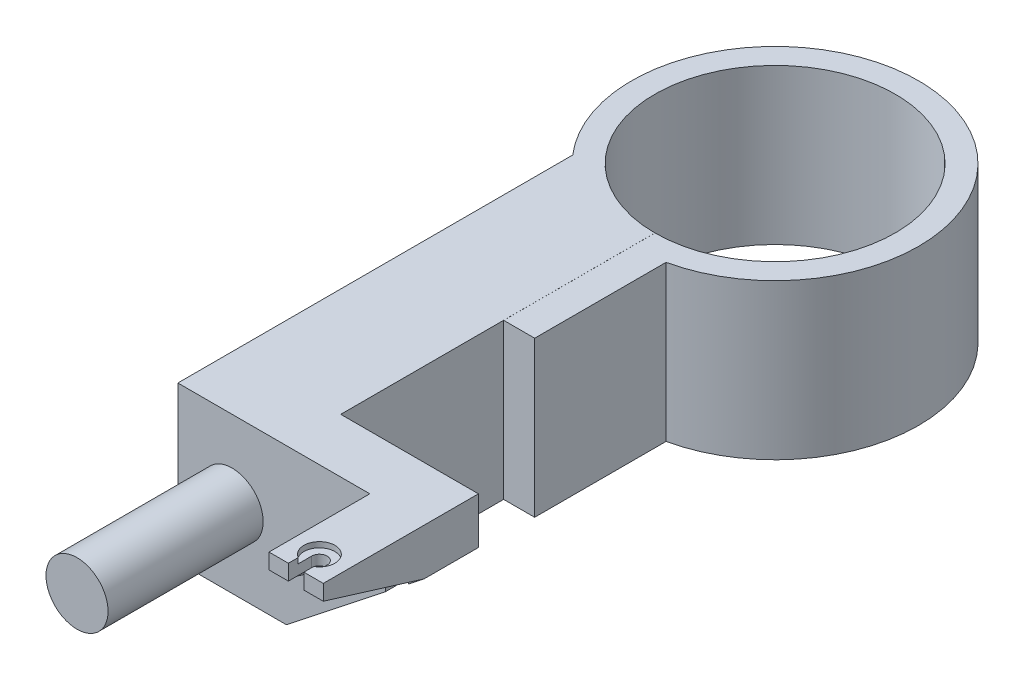
ISO-10303-21;
HEADER;
FILE_DESCRIPTION(('STEP AP214'),'2;1');
FILE_NAME('part.step','',(''),(''),'','','');
FILE_SCHEMA(('AUTOMOTIVE_DESIGN { 1 0 10303 214 1 1 1 1 }'));
ENDSEC;
DATA;
#1=APPLICATION_CONTEXT('core data for automotive mechanical design processes');
#2=APPLICATION_PROTOCOL_DEFINITION('international standard','automotive_design',2000,#1);
#3=PRODUCT_CONTEXT('',#1,'mechanical');
#4=PRODUCT('Part','Part','',(#3));
#5=PRODUCT_RELATED_PRODUCT_CATEGORY('part','',(#4));
#6=PRODUCT_DEFINITION_FORMATION('','',#4);
#7=PRODUCT_DEFINITION_CONTEXT('part definition',#1,'design');
#8=PRODUCT_DEFINITION('design','',#6,#7);
#9=PRODUCT_DEFINITION_SHAPE('','',#8);
#10=(LENGTH_UNIT() NAMED_UNIT(*) SI_UNIT(.MILLI.,.METRE.));
#11=(NAMED_UNIT(*) PLANE_ANGLE_UNIT() SI_UNIT($,.RADIAN.));
#12=(NAMED_UNIT(*) SI_UNIT($,.STERADIAN.) SOLID_ANGLE_UNIT());
#13=UNCERTAINTY_MEASURE_WITH_UNIT(LENGTH_MEASURE(1.E-05),#10,'distance_accuracy_value','');
#14=(GEOMETRIC_REPRESENTATION_CONTEXT(3) GLOBAL_UNCERTAINTY_ASSIGNED_CONTEXT((#13)) GLOBAL_UNIT_ASSIGNED_CONTEXT((#10,
#11,#12)) REPRESENTATION_CONTEXT('',''));
#15=CARTESIAN_POINT('',(0.,0.,0.));
#16=DIRECTION('',(0.,0.,1.));
#17=DIRECTION('',(1.,0.,0.));
#18=AXIS2_PLACEMENT_3D('',#15,#16,#17);
#19=CARTESIAN_POINT('',(14.249394375664,18.,73.));
#20=DIRECTION('',(0.,1.,0.));
#21=DIRECTION('',(0.,0.,1.));
#22=AXIS2_PLACEMENT_3D('',#19,#20,#21);
#23=CYLINDRICAL_SURFACE('',#22,1.);
#24=DIRECTION('',(0.,1.,0.));
#25=VECTOR('',#24,1.);
#26=CARTESIAN_POINT('',(15.249394375664,18.,73.));
#27=LINE('',#26,#25);
#28=CARTESIAN_POINT('',(15.249394375664,18.,73.));
#29=VERTEX_POINT('',#28);
#30=CARTESIAN_POINT('',(15.249394375664,19.3,73.));
#31=VERTEX_POINT('',#30);
#32=EDGE_CURVE('E427',#29,#31,#27,.T.);
#33=ORIENTED_EDGE('',*,*,#32,.T.);
#34=CARTESIAN_POINT('',(14.249394375664,19.3,73.));
#35=DIRECTION('',(0.,1.,0.));
#36=DIRECTION('',(0.,0.,1.));
#37=AXIS2_PLACEMENT_3D('',#34,#35,#36);
#38=CIRCLE('',#37,1.);
#39=CARTESIAN_POINT('',(13.249394375664,19.3,73.));
#40=VERTEX_POINT('',#39);
#41=EDGE_CURVE('E328',#31,#40,#38,.T.);
#42=ORIENTED_EDGE('',*,*,#41,.T.);
#43=DIRECTION('',(0.,1.,0.));
#44=VECTOR('',#43,1.);
#45=CARTESIAN_POINT('',(13.249394375664,18.,73.));
#46=LINE('',#45,#44);
#47=CARTESIAN_POINT('',(13.249394375664,18.,73.));
#48=VERTEX_POINT('',#47);
#49=EDGE_CURVE('E430',#48,#40,#46,.T.);
#50=ORIENTED_EDGE('',*,*,#49,.F.);
#51=CARTESIAN_POINT('',(14.249394375664,18.,73.));
#52=DIRECTION('',(0.,-1.,0.));
#53=DIRECTION('',(0.,0.,1.));
#54=AXIS2_PLACEMENT_3D('',#51,#52,#53);
#55=CIRCLE('',#54,1.);
#56=EDGE_CURVE('E389',#48,#29,#55,.T.);
#57=ORIENTED_EDGE('',*,*,#56,.T.);
#58=EDGE_LOOP('',(#33,#42,#50,#57));
#59=FACE_BOUND('',#58,.T.);
#60=ADVANCED_FACE('F41',(#59),#23,.F.);
#61=CARTESIAN_POINT('',(2.,18.,58.));
#62=DIRECTION('',(-1.,0.,0.));
#63=DIRECTION('',(0.,0.,1.));
#64=AXIS2_PLACEMENT_3D('',#61,#62,#63);
#65=PLANE('',#64);
#66=DIRECTION('',(0.,0.,-1.));
#67=VECTOR('',#66,1.);
#68=CARTESIAN_POINT('',(2.,18.,58.));
#69=LINE('',#68,#67);
#70=CARTESIAN_POINT('',(2.,18.,61.));
#71=VERTEX_POINT('',#70);
#72=CARTESIAN_POINT('',(2.,18.,58.));
#73=VERTEX_POINT('',#72);
#74=EDGE_CURVE('E340',#71,#73,#69,.T.);
#75=ORIENTED_EDGE('',*,*,#74,.F.);
#76=DIRECTION('',(0.,1.,0.));
#77=VECTOR('',#76,1.);
#78=CARTESIAN_POINT('',(2.,18.,61.));
#79=LINE('',#78,#77);
#80=CARTESIAN_POINT('',(2.,1.5775186131641,61.));
#81=VERTEX_POINT('',#80);
#82=EDGE_CURVE('E371',#81,#71,#79,.T.);
#83=ORIENTED_EDGE('',*,*,#82,.F.);
#84=DIRECTION('',(0.,0.,-1.));
#85=VECTOR('',#84,1.);
#86=CARTESIAN_POINT('',(2.,1.5775186131641,58.));
#87=LINE('',#86,#85);
#88=CARTESIAN_POINT('',(2.,1.5775186131641,58.));
#89=VERTEX_POINT('',#88);
#90=EDGE_CURVE('E355',#81,#89,#87,.T.);
#91=ORIENTED_EDGE('',*,*,#90,.T.);
#92=DIRECTION('',(0.,1.,0.));
#93=VECTOR('',#92,1.);
#94=CARTESIAN_POINT('',(2.,18.,58.));
#95=LINE('',#94,#93);
#96=EDGE_CURVE('E372',#89,#73,#95,.T.);
#97=ORIENTED_EDGE('',*,*,#96,.T.);
#98=EDGE_LOOP('',(#75,#83,#91,#97));
#99=FACE_BOUND('',#98,.T.);
#100=ADVANCED_FACE('F532',(#99),#65,.F.);
#101=CARTESIAN_POINT('',(2.,18.,58.));
#102=DIRECTION('',(0.,0.,-1.));
#103=DIRECTION('',(-1.,0.,0.));
#104=AXIS2_PLACEMENT_3D('',#101,#102,#103);
#105=PLANE('',#104);
#106=DIRECTION('',(1.,0.,0.));
#107=VECTOR('',#106,1.);
#108=CARTESIAN_POINT('',(15.749394375664,18.,58.));
#109=LINE('',#108,#107);
#110=CARTESIAN_POINT('',(15.749394375664,18.,58.));
#111=VERTEX_POINT('',#110);
#112=EDGE_CURVE('E337',#73,#111,#109,.T.);
#113=ORIENTED_EDGE('',*,*,#112,.F.);
#114=ORIENTED_EDGE('',*,*,#96,.F.);
#115=DIRECTION('',(0.785155480925612,0.619298692693978,0.));
#116=VECTOR('',#115,1.);
#117=CARTESIAN_POINT('',(9.98536199063244,7.87604719970196,58.));
#118=LINE('',#117,#116);
#119=CARTESIAN_POINT('',(15.749394375664,12.4224813868359,58.));
#120=VERTEX_POINT('',#119);
#121=EDGE_CURVE('E358',#89,#120,#118,.T.);
#122=ORIENTED_EDGE('',*,*,#121,.T.);
#123=DIRECTION('',(0.,1.,0.));
#124=VECTOR('',#123,1.);
#125=CARTESIAN_POINT('',(15.749394375664,18.,58.));
#126=LINE('',#125,#124);
#127=EDGE_CURVE('E376',#120,#111,#126,.T.);
#128=ORIENTED_EDGE('',*,*,#127,.T.);
#129=EDGE_LOOP('',(#113,#114,#122,#128));
#130=FACE_BOUND('',#129,.T.);
#131=ADVANCED_FACE('F535',(#130),#105,.F.);
#132=CARTESIAN_POINT('',(15.749394375664,18.,58.));
#133=DIRECTION('',(1.,0.,0.));
#134=DIRECTION('',(0.,0.,-1.));
#135=AXIS2_PLACEMENT_3D('',#132,#133,#134);
#136=PLANE('',#135);
#137=DIRECTION('',(0.,1.,0.));
#138=VECTOR('',#137,1.);
#139=CARTESIAN_POINT('',(15.749394375664,18.,63.));
#140=LINE('',#139,#138);
#141=CARTESIAN_POINT('',(15.749394375664,12.4224813868359,63.));
#142=VERTEX_POINT('',#141);
#143=CARTESIAN_POINT('',(15.749394375664,14.,63.));
#144=VERTEX_POINT('',#143);
#145=EDGE_CURVE('E322',#142,#144,#140,.T.);
#146=ORIENTED_EDGE('',*,*,#145,.T.);
#147=DIRECTION('',(0.,0.294085848837523,0.95577900872195));
#148=VECTOR('',#147,1.);
#149=CARTESIAN_POINT('',(15.749394375664,12.9405405405405,59.5567567567568));
#150=LINE('',#149,#148);
#151=CARTESIAN_POINT('',(15.749394375664,18.,76.));
#152=VERTEX_POINT('',#151);
#153=EDGE_CURVE('E314',#144,#152,#150,.T.);
#154=ORIENTED_EDGE('',*,*,#153,.T.);
#155=DIRECTION('',(0.,0.,-1.));
#156=VECTOR('',#155,1.);
#157=CARTESIAN_POINT('',(15.749394375664,18.,0.));
#158=LINE('',#157,#156);
#159=EDGE_CURVE('E369',#152,#111,#158,.T.);
#160=ORIENTED_EDGE('',*,*,#159,.T.);
#161=ORIENTED_EDGE('',*,*,#127,.F.);
#162=DIRECTION('',(0.,0.,1.));
#163=VECTOR('',#162,1.);
#164=CARTESIAN_POINT('',(15.749394375664,12.4224813868359,58.));
#165=LINE('',#164,#163);
#166=EDGE_CURVE('E364',#120,#142,#165,.T.);
#167=ORIENTED_EDGE('',*,*,#166,.T.);
#168=EDGE_LOOP('',(#146,#154,#160,#161,#167));
#169=FACE_BOUND('',#168,.T.);
#170=ADVANCED_FACE('F538',(#169),#136,.F.);
#171=CARTESIAN_POINT('',(12.749394375664,18.,61.));
#172=DIRECTION('',(-1.,0.,0.));
#173=DIRECTION('',(0.,0.,1.));
#174=AXIS2_PLACEMENT_3D('',#171,#172,#173);
#175=PLANE('',#174);
#176=DIRECTION('',(0.,0.,-1.));
#177=VECTOR('',#176,1.);
#178=CARTESIAN_POINT('',(12.749394375664,18.,0.));
#179=LINE('',#178,#177);
#180=CARTESIAN_POINT('',(12.749394375664,18.,76.));
#181=VERTEX_POINT('',#180);
#182=CARTESIAN_POINT('',(12.749394375664,18.,61.));
#183=VERTEX_POINT('',#182);
#184=EDGE_CURVE('E367',#181,#183,#179,.T.);
#185=ORIENTED_EDGE('',*,*,#184,.F.);
#186=DIRECTION('',(0.,-0.294085848837523,-0.95577900872195));
#187=VECTOR('',#186,1.);
#188=CARTESIAN_POINT('',(12.749394375664,13.7837837837838,62.2972972972973));
#189=LINE('',#188,#187);
#190=CARTESIAN_POINT('',(12.749394375664,14.,63.));
#191=VERTEX_POINT('',#190);
#192=EDGE_CURVE('E311',#181,#191,#189,.T.);
#193=ORIENTED_EDGE('',*,*,#192,.T.);
#194=DIRECTION('',(0.,-1.,0.));
#195=VECTOR('',#194,1.);
#196=CARTESIAN_POINT('',(12.749394375664,18.,63.));
#197=LINE('',#196,#195);
#198=CARTESIAN_POINT('',(12.749394375664,10.0562034670898,63.));
#199=VERTEX_POINT('',#198);
#200=EDGE_CURVE('E320',#191,#199,#197,.T.);
#201=ORIENTED_EDGE('',*,*,#200,.T.);
#202=DIRECTION('',(0.,0.,-1.));
#203=VECTOR('',#202,1.);
#204=CARTESIAN_POINT('',(12.749394375664,10.0562034670898,61.));
#205=LINE('',#204,#203);
#206=CARTESIAN_POINT('',(12.749394375664,10.0562034670898,61.));
#207=VERTEX_POINT('',#206);
#208=EDGE_CURVE('E352',#199,#207,#205,.T.);
#209=ORIENTED_EDGE('',*,*,#208,.T.);
#210=DIRECTION('',(0.,1.,0.));
#211=VECTOR('',#210,1.);
#212=CARTESIAN_POINT('',(12.749394375664,18.,61.));
#213=LINE('',#212,#211);
#214=EDGE_CURVE('E379',#207,#183,#213,.T.);
#215=ORIENTED_EDGE('',*,*,#214,.T.);
#216=EDGE_LOOP('',(#185,#193,#201,#209,#215));
#217=FACE_BOUND('',#216,.T.);
#218=ADVANCED_FACE('F522',(#217),#175,.F.);
#219=CARTESIAN_POINT('',(2.,18.,61.));
#220=DIRECTION('',(0.,0.,1.));
#221=DIRECTION('',(1.,0.,0.));
#222=AXIS2_PLACEMENT_3D('',#219,#220,#221);
#223=PLANE('',#222);
#224=DIRECTION('',(-1.,0.,0.));
#225=VECTOR('',#224,1.);
#226=CARTESIAN_POINT('',(2.,18.,61.));
#227=LINE('',#226,#225);
#228=EDGE_CURVE('E343',#183,#71,#227,.T.);
#229=ORIENTED_EDGE('',*,*,#228,.F.);
#230=ORIENTED_EDGE('',*,*,#214,.F.);
#231=DIRECTION('',(-0.785155480925612,-0.619298692693978,0.));
#232=VECTOR('',#231,1.);
#233=CARTESIAN_POINT('',(9.98536199063244,7.87604719970196,61.));
#234=LINE('',#233,#232);
#235=EDGE_CURVE('E483',#207,#81,#234,.T.);
#236=ORIENTED_EDGE('',*,*,#235,.T.);
#237=ORIENTED_EDGE('',*,*,#82,.T.);
#238=EDGE_LOOP('',(#229,#230,#236,#237));
#239=FACE_BOUND('',#238,.T.);
#240=ADVANCED_FACE('F528',(#239),#223,.F.);
#241=CARTESIAN_POINT('',(0.,20.,15.5));
#242=DIRECTION('',(-1.,0.,0.));
#243=DIRECTION('',(0.,0.,1.));
#244=AXIS2_PLACEMENT_3D('',#241,#242,#243);
#245=PLANE('',#244);
#246=DIRECTION('',(0.,1.,0.));
#247=VECTOR('',#246,1.);
#248=CARTESIAN_POINT('',(0.,18.,56.));
#249=LINE('',#248,#247);
#250=CARTESIAN_POINT('',(0.,0.,56.));
#251=VERTEX_POINT('',#250);
#252=CARTESIAN_POINT('',(0.,20.,56.));
#253=VERTEX_POINT('',#252);
#254=EDGE_CURVE('E416',#251,#253,#249,.T.);
#255=ORIENTED_EDGE('',*,*,#254,.F.);
#256=DIRECTION('',(0.,0.,-1.));
#257=VECTOR('',#256,1.);
#258=CARTESIAN_POINT('',(0.,0.,15.5));
#259=LINE('',#258,#257);
#260=CARTESIAN_POINT('',(0.,0.,15.5));
#261=VERTEX_POINT('',#260);
#262=EDGE_CURVE('E470',#251,#261,#259,.T.);
#263=ORIENTED_EDGE('',*,*,#262,.T.);
#264=DIRECTION('',(0.,-1.,0.));
#265=VECTOR('',#264,1.);
#266=CARTESIAN_POINT('',(0.,20.,15.5));
#267=LINE('',#266,#265);
#268=CARTESIAN_POINT('',(0.,20.,15.5));
#269=VERTEX_POINT('',#268);
#270=EDGE_CURVE('E252',#269,#261,#267,.T.);
#271=ORIENTED_EDGE('',*,*,#270,.F.);
#272=DIRECTION('',(0.,0.,-1.));
#273=VECTOR('',#272,1.);
#274=CARTESIAN_POINT('',(0.,20.,15.5));
#275=LINE('',#274,#273);
#276=EDGE_CURVE('E248',#253,#269,#275,.T.);
#277=ORIENTED_EDGE('',*,*,#276,.F.);
#278=EDGE_LOOP('',(#255,#263,#271,#277));
#279=FACE_BOUND('',#278,.T.);
#280=ADVANCED_FACE('F560',(#279),#245,.F.);
#281=CARTESIAN_POINT('',(14.249394375664,18.,73.));
#282=DIRECTION('',(0.,1.,0.));
#283=DIRECTION('',(0.,0.,1.));
#284=AXIS2_PLACEMENT_3D('',#281,#282,#283);
#285=PLANE('',#284);
#286=ORIENTED_EDGE('',*,*,#159,.F.);
#287=DIRECTION('',(1.,0.,0.));
#288=VECTOR('',#287,1.);
#289=CARTESIAN_POINT('',(15.249394375664,18.,76.));
#290=LINE('',#289,#288);
#291=CARTESIAN_POINT('',(15.249394375664,18.,76.));
#292=VERTEX_POINT('',#291);
#293=EDGE_CURVE('E395',#292,#152,#290,.T.);
#294=ORIENTED_EDGE('',*,*,#293,.F.);
#295=DIRECTION('',(0.,0.,1.));
#296=VECTOR('',#295,1.);
#297=CARTESIAN_POINT('',(15.249394375664,18.,73.));
#298=LINE('',#297,#296);
#299=EDGE_CURVE('E392',#29,#292,#298,.T.);
#300=ORIENTED_EDGE('',*,*,#299,.F.);
#301=ORIENTED_EDGE('',*,*,#56,.F.);
#302=DIRECTION('',(0.,0.,-1.));
#303=VECTOR('',#302,1.);
#304=CARTESIAN_POINT('',(13.249394375664,18.,73.));
#305=LINE('',#304,#303);
#306=CARTESIAN_POINT('',(13.249394375664,18.,76.));
#307=VERTEX_POINT('',#306);
#308=EDGE_CURVE('E385',#307,#48,#305,.T.);
#309=ORIENTED_EDGE('',*,*,#308,.F.);
#310=DIRECTION('',(1.,0.,0.));
#311=VECTOR('',#310,1.);
#312=CARTESIAN_POINT('',(10.749394375664,18.,76.));
#313=LINE('',#312,#311);
#314=EDGE_CURVE('E383',#181,#307,#313,.T.);
#315=ORIENTED_EDGE('',*,*,#314,.F.);
#316=ORIENTED_EDGE('',*,*,#184,.T.);
#317=ORIENTED_EDGE('',*,*,#228,.T.);
#318=ORIENTED_EDGE('',*,*,#74,.T.);
#319=ORIENTED_EDGE('',*,*,#112,.T.);
#320=EDGE_LOOP('',(#286,#294,#300,#301,#309,#315,#316,#317,#318,#319));
#321=FACE_BOUND('',#320,.T.);
#322=ADVANCED_FACE('F507',(#321),#285,.F.);
#323=CARTESIAN_POINT('',(-14.,20.,63.));
#324=DIRECTION('',(0.,0.,-1.));
#325=DIRECTION('',(-1.,0.,0.));
#326=AXIS2_PLACEMENT_3D('',#323,#324,#325);
#327=PLANE('',#326);
#328=DIRECTION('',(1.,0.,0.));
#329=VECTOR('',#328,1.);
#330=CARTESIAN_POINT('',(-13.1780414969752,14.,63.));
#331=LINE('',#330,#329);
#332=CARTESIAN_POINT('',(10.749394375664,14.,63.));
#333=VERTEX_POINT('',#332);
#334=EDGE_CURVE('E318',#333,#191,#331,.T.);
#335=ORIENTED_EDGE('',*,*,#334,.F.);
#336=DIRECTION('',(0.,1.,0.));
#337=VECTOR('',#336,1.);
#338=CARTESIAN_POINT('',(10.749394375664,18.,63.));
#339=LINE('',#338,#337);
#340=CARTESIAN_POINT('',(10.749394375664,20.,63.));
#341=VERTEX_POINT('',#340);
#342=EDGE_CURVE('E398',#333,#341,#339,.T.);
#343=ORIENTED_EDGE('',*,*,#342,.T.);
#344=DIRECTION('',(1.,0.,0.));
#345=VECTOR('',#344,1.);
#346=CARTESIAN_POINT('',(-14.,20.,63.));
#347=LINE('',#346,#345);
#348=CARTESIAN_POINT('',(-14.,20.,63.));
#349=VERTEX_POINT('',#348);
#350=EDGE_CURVE('E459',#349,#341,#347,.T.);
#351=ORIENTED_EDGE('',*,*,#350,.F.);
#352=DIRECTION('',(0.,-1.,0.));
#353=VECTOR('',#352,1.);
#354=CARTESIAN_POINT('',(-14.,20.,63.));
#355=LINE('',#354,#353);
#356=CARTESIAN_POINT('',(-14.,0.,63.));
#357=VERTEX_POINT('',#356);
#358=EDGE_CURVE('E474',#349,#357,#355,.T.);
#359=ORIENTED_EDGE('',*,*,#358,.T.);
#360=DIRECTION('',(1.,0.,0.));
#361=VECTOR('',#360,1.);
#362=CARTESIAN_POINT('',(-14.,0.,63.));
#363=LINE('',#362,#361);
#364=CARTESIAN_POINT('',(0.,0.,63.));
#365=VERTEX_POINT('',#364);
#366=EDGE_CURVE('E467',#357,#365,#363,.T.);
#367=ORIENTED_EDGE('',*,*,#366,.T.);
#368=DIRECTION('',(0.785155480925612,0.619298692693978,0.));
#369=VECTOR('',#368,1.);
#370=CARTESIAN_POINT('',(1.09434744878945,0.863176734867015,63.));
#371=LINE('',#370,#369);
#372=EDGE_CURVE('E361',#365,#199,#371,.T.);
#373=ORIENTED_EDGE('',*,*,#372,.T.);
#374=ORIENTED_EDGE('',*,*,#200,.F.);
#375=EDGE_LOOP('',(#335,#343,#351,#359,#367,#373,#374));
#376=FACE_BOUND('',#375,.T.);
#377=CARTESIAN_POINT('',(-6.99999999999999,10.,63.));
#378=DIRECTION('',(0.,0.,-1.));
#379=DIRECTION('',(-1.,0.,0.));
#380=AXIS2_PLACEMENT_3D('',#377,#378,#379);
#381=CIRCLE('',#380,4.);
#382=CARTESIAN_POINT('',(-11.,10.,63.));
#383=VERTEX_POINT('',#382);
#384=EDGE_CURVE('E480',#383,#383,#381,.F.);
#385=ORIENTED_EDGE('',*,*,#384,.F.);
#386=EDGE_LOOP('',(#385));
#387=FACE_BOUND('',#386,.T.);
#388=ADVANCED_FACE('F582',(#376,#387),#327,.F.);
#389=CARTESIAN_POINT('',(0.,20.,0.));
#390=DIRECTION('',(0.,1.,0.));
#391=DIRECTION('',(0.,0.,1.));
#392=AXIS2_PLACEMENT_3D('',#389,#390,#391);
#393=PLANE('',#392);
#394=CARTESIAN_POINT('',(14.249394375664,20.,73.));
#395=DIRECTION('',(0.,1.,0.));
#396=DIRECTION('',(0.,0.,1.));
#397=AXIS2_PLACEMENT_3D('',#394,#395,#396);
#398=CIRCLE('',#397,2.);
#399=CARTESIAN_POINT('',(15.249394375664,20.,74.7320508075689));
#400=VERTEX_POINT('',#399);
#401=CARTESIAN_POINT('',(13.249394375664,20.,74.7320508075689));
#402=VERTEX_POINT('',#401);
#403=EDGE_CURVE('E325',#400,#402,#398,.T.);
#404=ORIENTED_EDGE('',*,*,#403,.F.);
#405=DIRECTION('',(0.,0.,1.));
#406=VECTOR('',#405,1.);
#407=CARTESIAN_POINT('',(15.249394375664,20.,73.));
#408=LINE('',#407,#406);
#409=CARTESIAN_POINT('',(15.249394375664,20.,76.));
#410=VERTEX_POINT('',#409);
#411=EDGE_CURVE('E407',#400,#410,#408,.T.);
#412=ORIENTED_EDGE('',*,*,#411,.T.);
#413=DIRECTION('',(1.,0.,0.));
#414=VECTOR('',#413,1.);
#415=CARTESIAN_POINT('',(15.249394375664,20.,76.));
#416=LINE('',#415,#414);
#417=CARTESIAN_POINT('',(17.749394375664,20.,76.));
#418=VERTEX_POINT('',#417);
#419=EDGE_CURVE('E409',#410,#418,#416,.T.);
#420=ORIENTED_EDGE('',*,*,#419,.T.);
#421=DIRECTION('',(0.,0.,-1.));
#422=VECTOR('',#421,1.);
#423=CARTESIAN_POINT('',(17.749394375664,20.,76.));
#424=LINE('',#423,#422);
#425=CARTESIAN_POINT('',(17.749394375664,20.,56.));
#426=VERTEX_POINT('',#425);
#427=EDGE_CURVE('E412',#418,#426,#424,.T.);
#428=ORIENTED_EDGE('',*,*,#427,.T.);
#429=DIRECTION('',(-1.,0.,0.));
#430=VECTOR('',#429,1.);
#431=CARTESIAN_POINT('',(17.749394375664,20.,56.));
#432=LINE('',#431,#430);
#433=EDGE_CURVE('E386',#426,#253,#432,.T.);
#434=ORIENTED_EDGE('',*,*,#433,.T.);
#435=ORIENTED_EDGE('',*,*,#276,.T.);
#436=CARTESIAN_POINT('',(0.,20.,0.));
#437=DIRECTION('',(0.,-1.,0.));
#438=DIRECTION('',(0.,0.,1.));
#439=AXIS2_PLACEMENT_3D('',#436,#437,#438);
#440=CIRCLE('',#439,15.5);
#441=CARTESIAN_POINT('',(0.01,20.,15.4999967741932));
#442=VERTEX_POINT('',#441);
#443=EDGE_CURVE('E239',#269,#442,#440,.T.);
#444=ORIENTED_EDGE('',*,*,#443,.T.);
#445=DIRECTION('',(0.,0.,-1.));
#446=VECTOR('',#445,1.);
#447=CARTESIAN_POINT('',(0.0100000000000048,20.,35.));
#448=LINE('',#447,#446);
#449=CARTESIAN_POINT('',(0.0100000000000048,20.,35.));
#450=VERTEX_POINT('',#449);
#451=EDGE_CURVE('E245',#450,#442,#448,.T.);
#452=ORIENTED_EDGE('',*,*,#451,.F.);
#453=DIRECTION('',(1.,0.,0.));
#454=VECTOR('',#453,1.);
#455=CARTESIAN_POINT('',(0.0100000000000048,20.,35.));
#456=LINE('',#455,#454);
#457=CARTESIAN_POINT('',(4.00000000000001,20.,35.));
#458=VERTEX_POINT('',#457);
#459=EDGE_CURVE('E271',#450,#458,#456,.T.);
#460=ORIENTED_EDGE('',*,*,#459,.T.);
#461=DIRECTION('',(0.,0.,-1.));
#462=VECTOR('',#461,1.);
#463=CARTESIAN_POINT('',(4.00000000000001,20.,35.));
#464=LINE('',#463,#462);
#465=CARTESIAN_POINT('',(4.,20.,18.0623918681884));
#466=VERTEX_POINT('',#465);
#467=EDGE_CURVE('E268',#458,#466,#464,.T.);
#468=ORIENTED_EDGE('',*,*,#467,.T.);
#469=CARTESIAN_POINT('',(0.,20.,0.));
#470=DIRECTION('',(0.,1.,0.));
#471=DIRECTION('',(0.,0.,1.));
#472=AXIS2_PLACEMENT_3D('',#469,#470,#471);
#473=CIRCLE('',#472,18.5);
#474=CARTESIAN_POINT('',(-14.,20.,12.0933866224478));
#475=VERTEX_POINT('',#474);
#476=EDGE_CURVE('E454',#466,#475,#473,.T.);
#477=ORIENTED_EDGE('',*,*,#476,.T.);
#478=DIRECTION('',(0.,0.,1.));
#479=VECTOR('',#478,1.);
#480=CARTESIAN_POINT('',(-14.,20.,12.0933866224478));
#481=LINE('',#480,#479);
#482=EDGE_CURVE('E457',#475,#349,#481,.T.);
#483=ORIENTED_EDGE('',*,*,#482,.T.);
#484=ORIENTED_EDGE('',*,*,#350,.T.);
#485=DIRECTION('',(0.,0.,1.));
#486=VECTOR('',#485,1.);
#487=CARTESIAN_POINT('',(10.749394375664,20.,63.));
#488=LINE('',#487,#486);
#489=CARTESIAN_POINT('',(10.749394375664,20.,76.));
#490=VERTEX_POINT('',#489);
#491=EDGE_CURVE('E375',#341,#490,#488,.T.);
#492=ORIENTED_EDGE('',*,*,#491,.T.);
#493=DIRECTION('',(1.,0.,0.));
#494=VECTOR('',#493,1.);
#495=CARTESIAN_POINT('',(10.749394375664,20.,76.));
#496=LINE('',#495,#494);
#497=CARTESIAN_POINT('',(13.249394375664,20.,76.));
#498=VERTEX_POINT('',#497);
#499=EDGE_CURVE('E401',#490,#498,#496,.T.);
#500=ORIENTED_EDGE('',*,*,#499,.T.);
#501=DIRECTION('',(0.,0.,-1.));
#502=VECTOR('',#501,1.);
#503=CARTESIAN_POINT('',(13.249394375664,20.,73.));
#504=LINE('',#503,#502);
#505=EDGE_CURVE('E404',#498,#402,#504,.T.);
#506=ORIENTED_EDGE('',*,*,#505,.T.);
#507=EDGE_LOOP('',(#404,#412,#420,#428,#434,#435,#444,#452,#460,#468,#477,#483,#484,#492,#500,#506));
#508=FACE_BOUND('',#507,.T.);
#509=ADVANCED_FACE('F242',(#508),#393,.T.);
#510=CARTESIAN_POINT('',(0.,0.,0.));
#511=DIRECTION('',(0.,1.,0.));
#512=DIRECTION('',(0.,0.,1.));
#513=AXIS2_PLACEMENT_3D('',#510,#511,#512);
#514=PLANE('',#513);
#515=ORIENTED_EDGE('',*,*,#262,.F.);
#516=DIRECTION('',(0.,0.,-1.));
#517=VECTOR('',#516,1.);
#518=CARTESIAN_POINT('',(0.,0.,78.));
#519=LINE('',#518,#517);
#520=EDGE_CURVE('E349',#365,#251,#519,.T.);
#521=ORIENTED_EDGE('',*,*,#520,.F.);
#522=ORIENTED_EDGE('',*,*,#366,.F.);
#523=DIRECTION('',(0.,0.,1.));
#524=VECTOR('',#523,1.);
#525=CARTESIAN_POINT('',(-14.,0.,12.0933866224478));
#526=LINE('',#525,#524);
#527=CARTESIAN_POINT('',(-14.,0.,12.0933866224478));
#528=VERTEX_POINT('',#527);
#529=EDGE_CURVE('E465',#528,#357,#526,.T.);
#530=ORIENTED_EDGE('',*,*,#529,.F.);
#531=CARTESIAN_POINT('',(0.,0.,0.));
#532=DIRECTION('',(0.,1.,0.));
#533=DIRECTION('',(0.,0.,1.));
#534=AXIS2_PLACEMENT_3D('',#531,#532,#533);
#535=CIRCLE('',#534,18.5);
#536=CARTESIAN_POINT('',(4.,0.,18.0623918681884));
#537=VERTEX_POINT('',#536);
#538=EDGE_CURVE('E453',#537,#528,#535,.T.);
#539=ORIENTED_EDGE('',*,*,#538,.F.);
#540=DIRECTION('',(0.,0.,1.));
#541=VECTOR('',#540,1.);
#542=CARTESIAN_POINT('',(4.00000000000001,0.,35.));
#543=LINE('',#542,#541);
#544=CARTESIAN_POINT('',(4.00000000000001,0.,35.));
#545=VERTEX_POINT('',#544);
#546=EDGE_CURVE('E262',#537,#545,#543,.T.);
#547=ORIENTED_EDGE('',*,*,#546,.T.);
#548=DIRECTION('',(-1.,0.,0.));
#549=VECTOR('',#548,1.);
#550=CARTESIAN_POINT('',(0.0100000000000048,0.,35.));
#551=LINE('',#550,#549);
#552=CARTESIAN_POINT('',(0.0100000000000048,0.,35.));
#553=VERTEX_POINT('',#552);
#554=EDGE_CURVE('E283',#545,#553,#551,.T.);
#555=ORIENTED_EDGE('',*,*,#554,.T.);
#556=DIRECTION('',(0.,0.,1.));
#557=VECTOR('',#556,1.);
#558=CARTESIAN_POINT('',(0.0100000000000048,0.,35.));
#559=LINE('',#558,#557);
#560=CARTESIAN_POINT('',(0.01,0.,15.4999967741932));
#561=VERTEX_POINT('',#560);
#562=EDGE_CURVE('E274',#561,#553,#559,.T.);
#563=ORIENTED_EDGE('',*,*,#562,.F.);
#564=CARTESIAN_POINT('',(0.,0.,0.));
#565=DIRECTION('',(0.,-1.,0.));
#566=DIRECTION('',(0.,0.,1.));
#567=AXIS2_PLACEMENT_3D('',#564,#565,#566);
#568=CIRCLE('',#567,15.5);
#569=EDGE_CURVE('E258',#261,#561,#568,.T.);
#570=ORIENTED_EDGE('',*,*,#569,.F.);
#571=EDGE_LOOP('',(#515,#521,#522,#530,#539,#547,#555,#563,#570));
#572=FACE_BOUND('',#571,.T.);
#573=ADVANCED_FACE('F562',(#572),#514,.F.);
#574=CARTESIAN_POINT('',(0.,20.,0.));
#575=DIRECTION('',(0.,-1.,0.));
#576=DIRECTION('',(0.,0.,-1.));
#577=AXIS2_PLACEMENT_3D('',#574,#575,#576);
#578=CYLINDRICAL_SURFACE('',#577,18.5);
#579=ORIENTED_EDGE('',*,*,#538,.T.);
#580=DIRECTION('',(0.,-1.,0.));
#581=VECTOR('',#580,1.);
#582=CARTESIAN_POINT('',(-14.,20.,12.0933866224478));
#583=LINE('',#582,#581);
#584=EDGE_CURVE('E477',#475,#528,#583,.T.);
#585=ORIENTED_EDGE('',*,*,#584,.F.);
#586=ORIENTED_EDGE('',*,*,#476,.F.);
#587=DIRECTION('',(0.,1.,0.));
#588=VECTOR('',#587,1.);
#589=CARTESIAN_POINT('',(4.,-56.6083032778761,18.0623918681884));
#590=LINE('',#589,#588);
#591=EDGE_CURVE('E263',#537,#466,#590,.T.);
#592=ORIENTED_EDGE('',*,*,#591,.F.);
#593=EDGE_LOOP('',(#579,#585,#586,#592));
#594=FACE_BOUND('',#593,.T.);
#595=ADVANCED_FACE('F43',(#594),#578,.T.);
#596=CARTESIAN_POINT('',(-14.,20.,12.0933866224478));
#597=DIRECTION('',(1.,0.,0.));
#598=DIRECTION('',(0.,0.,-1.));
#599=AXIS2_PLACEMENT_3D('',#596,#597,#598);
#600=PLANE('',#599);
#601=ORIENTED_EDGE('',*,*,#529,.T.);
#602=ORIENTED_EDGE('',*,*,#358,.F.);
#603=ORIENTED_EDGE('',*,*,#482,.F.);
#604=ORIENTED_EDGE('',*,*,#584,.T.);
#605=EDGE_LOOP('',(#601,#602,#603,#604));
#606=FACE_BOUND('',#605,.T.);
#607=ADVANCED_FACE('F577',(#606),#600,.F.);
#608=CARTESIAN_POINT('',(0.,20.,0.));
#609=DIRECTION('',(0.,-1.,0.));
#610=DIRECTION('',(0.,0.,-1.));
#611=AXIS2_PLACEMENT_3D('',#608,#609,#610);
#612=CYLINDRICAL_SURFACE('',#611,15.5);
#613=ORIENTED_EDGE('',*,*,#569,.T.);
#614=DIRECTION('',(0.,1.,0.));
#615=VECTOR('',#614,1.);
#616=CARTESIAN_POINT('',(0.01,-56.6083032778761,15.4999967741932));
#617=LINE('',#616,#615);
#618=EDGE_CURVE('E255',#561,#442,#617,.T.);
#619=ORIENTED_EDGE('',*,*,#618,.T.);
#620=ORIENTED_EDGE('',*,*,#443,.F.);
#621=ORIENTED_EDGE('',*,*,#270,.T.);
#622=EDGE_LOOP('',(#613,#619,#620,#621));
#623=FACE_BOUND('',#622,.T.);
#624=ADVANCED_FACE('F256',(#623),#612,.F.);
#625=CARTESIAN_POINT('',(-6.99999999999999,10.,83.));
#626=DIRECTION('',(0.,0.,-1.));
#627=DIRECTION('',(-1.,0.,0.));
#628=AXIS2_PLACEMENT_3D('',#625,#626,#627);
#629=CYLINDRICAL_SURFACE('',#628,4.);
#630=CARTESIAN_POINT('',(-6.99999999999999,10.,83.));
#631=DIRECTION('',(0.,0.,1.));
#632=DIRECTION('',(1.,0.,0.));
#633=AXIS2_PLACEMENT_3D('',#630,#631,#632);
#634=CIRCLE('',#633,4.);
#635=CARTESIAN_POINT('',(-2.99999999999999,10.,83.));
#636=VERTEX_POINT('',#635);
#637=EDGE_CURVE('E419',#636,#636,#634,.T.);
#638=ORIENTED_EDGE('',*,*,#637,.F.);
#639=EDGE_LOOP('',(#638));
#640=FACE_BOUND('',#639,.T.);
#641=ORIENTED_EDGE('',*,*,#384,.T.);
#642=EDGE_LOOP('',(#641));
#643=FACE_BOUND('',#642,.T.);
#644=ADVANCED_FACE('F729',(#640,#643),#629,.T.);
#645=CARTESIAN_POINT('',(-6.99999999999999,10.,83.));
#646=DIRECTION('',(0.,0.,1.));
#647=DIRECTION('',(1.,0.,0.));
#648=AXIS2_PLACEMENT_3D('',#645,#646,#647);
#649=PLANE('',#648);
#650=ORIENTED_EDGE('',*,*,#637,.T.);
#651=EDGE_LOOP('',(#650));
#652=FACE_BOUND('',#651,.T.);
#653=ADVANCED_FACE('F613',(#652),#649,.T.);
#654=CARTESIAN_POINT('',(17.749394375664,18.,56.));
#655=DIRECTION('',(0.,0.,-1.));
#656=DIRECTION('',(-1.,0.,0.));
#657=AXIS2_PLACEMENT_3D('',#654,#655,#656);
#658=PLANE('',#657);
#659=DIRECTION('',(0.785155480925612,0.619298692693978,0.));
#660=VECTOR('',#659,1.);
#661=CARTESIAN_POINT('',(0.,0.,56.));
#662=LINE('',#661,#660);
#663=CARTESIAN_POINT('',(17.749394375664,14.,56.));
#664=VERTEX_POINT('',#663);
#665=EDGE_CURVE('E346',#251,#664,#662,.T.);
#666=ORIENTED_EDGE('',*,*,#665,.F.);
#667=ORIENTED_EDGE('',*,*,#254,.T.);
#668=ORIENTED_EDGE('',*,*,#433,.F.);
#669=DIRECTION('',(0.,1.,0.));
#670=VECTOR('',#669,1.);
#671=CARTESIAN_POINT('',(17.749394375664,18.,56.));
#672=LINE('',#671,#670);
#673=EDGE_CURVE('E420',#664,#426,#672,.T.);
#674=ORIENTED_EDGE('',*,*,#673,.F.);
#675=EDGE_LOOP('',(#666,#667,#668,#674));
#676=FACE_BOUND('',#675,.T.);
#677=ADVANCED_FACE('F556',(#676),#658,.T.);
#678=CARTESIAN_POINT('',(17.749394375664,18.,76.));
#679=DIRECTION('',(1.,0.,0.));
#680=DIRECTION('',(0.,0.,-1.));
#681=AXIS2_PLACEMENT_3D('',#678,#679,#680);
#682=PLANE('',#681);
#683=DIRECTION('',(0.,0.294085848837523,0.95577900872195));
#684=VECTOR('',#683,1.);
#685=CARTESIAN_POINT('',(17.749394375664,14.,63.));
#686=LINE('',#685,#684);
#687=CARTESIAN_POINT('',(17.749394375664,14.,63.));
#688=VERTEX_POINT('',#687);
#689=CARTESIAN_POINT('',(17.749394375664,18.,76.));
#690=VERTEX_POINT('',#689);
#691=EDGE_CURVE('E302',#688,#690,#686,.T.);
#692=ORIENTED_EDGE('',*,*,#691,.F.);
#693=DIRECTION('',(0.,0.,-1.));
#694=VECTOR('',#693,1.);
#695=CARTESIAN_POINT('',(17.749394375664,14.,78.));
#696=LINE('',#695,#694);
#697=EDGE_CURVE('E350',#688,#664,#696,.T.);
#698=ORIENTED_EDGE('',*,*,#697,.T.);
#699=ORIENTED_EDGE('',*,*,#673,.T.);
#700=ORIENTED_EDGE('',*,*,#427,.F.);
#701=DIRECTION('',(0.,1.,0.));
#702=VECTOR('',#701,1.);
#703=CARTESIAN_POINT('',(17.749394375664,18.,76.));
#704=LINE('',#703,#702);
#705=EDGE_CURVE('E422',#690,#418,#704,.T.);
#706=ORIENTED_EDGE('',*,*,#705,.F.);
#707=EDGE_LOOP('',(#692,#698,#699,#700,#706));
#708=FACE_BOUND('',#707,.T.);
#709=ADVANCED_FACE('F552',(#708),#682,.T.);
#710=CARTESIAN_POINT('',(15.249394375664,18.,76.));
#711=DIRECTION('',(0.,0.,1.));
#712=DIRECTION('',(1.,0.,0.));
#713=AXIS2_PLACEMENT_3D('',#710,#711,#712);
#714=PLANE('',#713);
#715=DIRECTION('',(1.,0.,0.));
#716=VECTOR('',#715,1.);
#717=CARTESIAN_POINT('',(-3.47890914337223,18.,76.));
#718=LINE('',#717,#716);
#719=EDGE_CURVE('E307',#152,#690,#718,.T.);
#720=ORIENTED_EDGE('',*,*,#719,.T.);
#721=ORIENTED_EDGE('',*,*,#705,.T.);
#722=ORIENTED_EDGE('',*,*,#419,.F.);
#723=DIRECTION('',(0.,1.,0.));
#724=VECTOR('',#723,1.);
#725=CARTESIAN_POINT('',(15.249394375664,18.,76.));
#726=LINE('',#725,#724);
#727=EDGE_CURVE('E424',#292,#410,#726,.T.);
#728=ORIENTED_EDGE('',*,*,#727,.F.);
#729=ORIENTED_EDGE('',*,*,#293,.T.);
#730=EDGE_LOOP('',(#720,#721,#722,#728,#729));
#731=FACE_BOUND('',#730,.T.);
#732=ADVANCED_FACE('F511',(#731),#714,.T.);
#733=CARTESIAN_POINT('',(15.249394375664,18.,73.));
#734=DIRECTION('',(-1.,0.,0.));
#735=DIRECTION('',(0.,0.,1.));
#736=AXIS2_PLACEMENT_3D('',#733,#734,#735);
#737=PLANE('',#736);
#738=DIRECTION('',(0.,1.,0.));
#739=VECTOR('',#738,1.);
#740=CARTESIAN_POINT('',(15.249394375664,19.3,74.7320508075689));
#741=LINE('',#740,#739);
#742=CARTESIAN_POINT('',(15.249394375664,19.3,74.7320508075689));
#743=VERTEX_POINT('',#742);
#744=EDGE_CURVE('E335',#743,#400,#741,.T.);
#745=ORIENTED_EDGE('',*,*,#744,.F.);
#746=DIRECTION('',(0.,0.,-1.));
#747=VECTOR('',#746,1.);
#748=CARTESIAN_POINT('',(15.249394375664,19.3,73.));
#749=LINE('',#748,#747);
#750=EDGE_CURVE('E332',#743,#31,#749,.T.);
#751=ORIENTED_EDGE('',*,*,#750,.T.);
#752=ORIENTED_EDGE('',*,*,#32,.F.);
#753=ORIENTED_EDGE('',*,*,#299,.T.);
#754=ORIENTED_EDGE('',*,*,#727,.T.);
#755=ORIENTED_EDGE('',*,*,#411,.F.);
#756=EDGE_LOOP('',(#745,#751,#752,#753,#754,#755));
#757=FACE_BOUND('',#756,.T.);
#758=ADVANCED_FACE('F503',(#757),#737,.T.);
#759=CARTESIAN_POINT('',(13.249394375664,18.,73.));
#760=DIRECTION('',(1.,0.,0.));
#761=DIRECTION('',(0.,0.,-1.));
#762=AXIS2_PLACEMENT_3D('',#759,#760,#761);
#763=PLANE('',#762);
#764=DIRECTION('',(0.,1.,0.));
#765=VECTOR('',#764,1.);
#766=CARTESIAN_POINT('',(13.249394375664,19.3,74.7320508075689));
#767=LINE('',#766,#765);
#768=CARTESIAN_POINT('',(13.249394375664,19.3,74.7320508075689));
#769=VERTEX_POINT('',#768);
#770=EDGE_CURVE('E50',#402,#769,#767,.F.);
#771=ORIENTED_EDGE('',*,*,#770,.F.);
#772=ORIENTED_EDGE('',*,*,#505,.F.);
#773=DIRECTION('',(0.,1.,0.));
#774=VECTOR('',#773,1.);
#775=CARTESIAN_POINT('',(13.249394375664,18.,76.));
#776=LINE('',#775,#774);
#777=EDGE_CURVE('E433',#307,#498,#776,.T.);
#778=ORIENTED_EDGE('',*,*,#777,.F.);
#779=ORIENTED_EDGE('',*,*,#308,.T.);
#780=ORIENTED_EDGE('',*,*,#49,.T.);
#781=DIRECTION('',(0.,0.,1.));
#782=VECTOR('',#781,1.);
#783=CARTESIAN_POINT('',(13.249394375664,19.3,73.));
#784=LINE('',#783,#782);
#785=EDGE_CURVE('E486',#40,#769,#784,.T.);
#786=ORIENTED_EDGE('',*,*,#785,.T.);
#787=EDGE_LOOP('',(#771,#772,#778,#779,#780,#786));
#788=FACE_BOUND('',#787,.T.);
#789=ADVANCED_FACE('F496',(#788),#763,.T.);
#790=CARTESIAN_POINT('',(10.749394375664,18.,76.));
#791=DIRECTION('',(0.,0.,1.));
#792=DIRECTION('',(1.,0.,0.));
#793=AXIS2_PLACEMENT_3D('',#790,#791,#792);
#794=PLANE('',#793);
#795=CARTESIAN_POINT('',(10.749394375664,18.,76.));
#796=VERTEX_POINT('',#795);
#797=EDGE_CURVE('E308',#796,#181,#718,.T.);
#798=ORIENTED_EDGE('',*,*,#797,.T.);
#799=ORIENTED_EDGE('',*,*,#314,.T.);
#800=ORIENTED_EDGE('',*,*,#777,.T.);
#801=ORIENTED_EDGE('',*,*,#499,.F.);
#802=DIRECTION('',(0.,1.,0.));
#803=VECTOR('',#802,1.);
#804=CARTESIAN_POINT('',(10.749394375664,18.,76.));
#805=LINE('',#804,#803);
#806=EDGE_CURVE('E435',#796,#490,#805,.T.);
#807=ORIENTED_EDGE('',*,*,#806,.F.);
#808=EDGE_LOOP('',(#798,#799,#800,#801,#807));
#809=FACE_BOUND('',#808,.T.);
#810=ADVANCED_FACE('F589',(#809),#794,.T.);
#811=CARTESIAN_POINT('',(10.749394375664,18.,63.));
#812=DIRECTION('',(-1.,0.,0.));
#813=DIRECTION('',(0.,0.,1.));
#814=AXIS2_PLACEMENT_3D('',#811,#812,#813);
#815=PLANE('',#814);
#816=DIRECTION('',(0.,0.294085848837523,0.95577900872195));
#817=VECTOR('',#816,1.);
#818=CARTESIAN_POINT('',(10.749394375664,14.,63.));
#819=LINE('',#818,#817);
#820=EDGE_CURVE('E304',#333,#796,#819,.T.);
#821=ORIENTED_EDGE('',*,*,#820,.T.);
#822=ORIENTED_EDGE('',*,*,#806,.T.);
#823=ORIENTED_EDGE('',*,*,#491,.F.);
#824=ORIENTED_EDGE('',*,*,#342,.F.);
#825=EDGE_LOOP('',(#821,#822,#823,#824));
#826=FACE_BOUND('',#825,.T.);
#827=ADVANCED_FACE('F587',(#826),#815,.T.);
#828=CARTESIAN_POINT('',(0.,0.,78.));
#829=DIRECTION('',(-0.619298692693978,0.785155480925612,0.));
#830=DIRECTION('',(-0.785155480925612,-0.619298692693978,0.));
#831=AXIS2_PLACEMENT_3D('',#828,#829,#830);
#832=PLANE('',#831);
#833=ORIENTED_EDGE('',*,*,#697,.F.);
#834=DIRECTION('',(-0.785155480925612,-0.619298692693978,0.));
#835=VECTOR('',#834,1.);
#836=CARTESIAN_POINT('',(0.,0.,63.));
#837=LINE('',#836,#835);
#838=EDGE_CURVE('E11',#688,#142,#837,.T.);
#839=ORIENTED_EDGE('',*,*,#838,.T.);
#840=ORIENTED_EDGE('',*,*,#166,.F.);
#841=ORIENTED_EDGE('',*,*,#121,.F.);
#842=ORIENTED_EDGE('',*,*,#90,.F.);
#843=ORIENTED_EDGE('',*,*,#235,.F.);
#844=ORIENTED_EDGE('',*,*,#208,.F.);
#845=ORIENTED_EDGE('',*,*,#372,.F.);
#846=ORIENTED_EDGE('',*,*,#520,.T.);
#847=ORIENTED_EDGE('',*,*,#665,.T.);
#848=EDGE_LOOP('',(#833,#839,#840,#841,#842,#843,#844,#845,#846,#847));
#849=FACE_BOUND('',#848,.T.);
#850=ADVANCED_FACE('F548',(#849),#832,.F.);
#851=CARTESIAN_POINT('',(14.249394375664,19.3,73.));
#852=DIRECTION('',(0.,1.,0.));
#853=DIRECTION('',(0.,0.,1.));
#854=AXIS2_PLACEMENT_3D('',#851,#852,#853);
#855=CYLINDRICAL_SURFACE('',#854,2.);
#856=ORIENTED_EDGE('',*,*,#744,.T.);
#857=ORIENTED_EDGE('',*,*,#403,.T.);
#858=ORIENTED_EDGE('',*,*,#770,.T.);
#859=CARTESIAN_POINT('',(14.249394375664,19.3,73.));
#860=DIRECTION('',(0.,1.,0.));
#861=DIRECTION('',(0.,0.,1.));
#862=AXIS2_PLACEMENT_3D('',#859,#860,#861);
#863=CIRCLE('',#862,2.);
#864=EDGE_CURVE('E326',#743,#769,#863,.T.);
#865=ORIENTED_EDGE('',*,*,#864,.F.);
#866=EDGE_LOOP('',(#856,#857,#858,#865));
#867=FACE_BOUND('',#866,.T.);
#868=ADVANCED_FACE('F492',(#867),#855,.F.);
#869=CARTESIAN_POINT('',(14.249394375664,19.3,73.));
#870=DIRECTION('',(0.,1.,0.));
#871=DIRECTION('',(0.,0.,1.));
#872=AXIS2_PLACEMENT_3D('',#869,#870,#871);
#873=PLANE('',#872);
#874=ORIENTED_EDGE('',*,*,#864,.T.);
#875=ORIENTED_EDGE('',*,*,#785,.F.);
#876=ORIENTED_EDGE('',*,*,#41,.F.);
#877=ORIENTED_EDGE('',*,*,#750,.F.);
#878=EDGE_LOOP('',(#874,#875,#876,#877));
#879=FACE_BOUND('',#878,.T.);
#880=ADVANCED_FACE('F498',(#879),#873,.T.);
#881=CARTESIAN_POINT('',(-13.1780414969752,0.415062819725904,63.));
#882=DIRECTION('',(0.,0.,-1.));
#883=DIRECTION('',(-1.,0.,0.));
#884=AXIS2_PLACEMENT_3D('',#881,#882,#883);
#885=PLANE('',#884);
#886=ORIENTED_EDGE('',*,*,#838,.F.);
#887=EDGE_CURVE('E317',#144,#688,#331,.T.);
#888=ORIENTED_EDGE('',*,*,#887,.F.);
#889=ORIENTED_EDGE('',*,*,#145,.F.);
#890=EDGE_LOOP('',(#886,#888,#889));
#891=FACE_BOUND('',#890,.T.);
#892=ADVANCED_FACE('F545',(#891),#885,.F.);
#893=CARTESIAN_POINT('',(-3.47890914337223,14.,63.));
#894=DIRECTION('',(0.,0.95577900872195,-0.294085848837523));
#895=DIRECTION('',(0.,0.294085848837523,0.95577900872195));
#896=AXIS2_PLACEMENT_3D('',#893,#894,#895);
#897=PLANE('',#896);
#898=ORIENTED_EDGE('',*,*,#887,.T.);
#899=ORIENTED_EDGE('',*,*,#691,.T.);
#900=ORIENTED_EDGE('',*,*,#719,.F.);
#901=ORIENTED_EDGE('',*,*,#153,.F.);
#902=EDGE_LOOP('',(#898,#899,#900,#901));
#903=FACE_BOUND('',#902,.T.);
#904=ADVANCED_FACE('F541',(#903),#897,.F.);
#905=ORIENTED_EDGE('',*,*,#797,.F.);
#906=ORIENTED_EDGE('',*,*,#820,.F.);
#907=ORIENTED_EDGE('',*,*,#334,.T.);
#908=ORIENTED_EDGE('',*,*,#192,.F.);
#909=EDGE_LOOP('',(#905,#906,#907,#908));
#910=FACE_BOUND('',#909,.T.);
#911=ADVANCED_FACE('F634',(#910),#897,.F.);
#912=CARTESIAN_POINT('',(0.0100000000000048,-56.6083032778761,35.));
#913=DIRECTION('',(1.,0.,0.));
#914=DIRECTION('',(0.,0.,-1.));
#915=AXIS2_PLACEMENT_3D('',#912,#913,#914);
#916=PLANE('',#915);
#917=ORIENTED_EDGE('',*,*,#618,.F.);
#918=ORIENTED_EDGE('',*,*,#562,.T.);
#919=DIRECTION('',(0.,1.,0.));
#920=VECTOR('',#919,1.);
#921=CARTESIAN_POINT('',(0.0100000000000048,-56.6083032778761,35.));
#922=LINE('',#921,#920);
#923=EDGE_CURVE('E267',#553,#450,#922,.T.);
#924=ORIENTED_EDGE('',*,*,#923,.T.);
#925=ORIENTED_EDGE('',*,*,#451,.T.);
#926=EDGE_LOOP('',(#917,#918,#924,#925));
#927=FACE_BOUND('',#926,.T.);
#928=ADVANCED_FACE('F265',(#927),#916,.F.);
#929=CARTESIAN_POINT('',(4.00000000000001,-56.6083032778761,35.));
#930=DIRECTION('',(1.,0.,0.));
#931=DIRECTION('',(0.,0.,-1.));
#932=AXIS2_PLACEMENT_3D('',#929,#930,#931);
#933=PLANE('',#932);
#934=ORIENTED_EDGE('',*,*,#546,.F.);
#935=ORIENTED_EDGE('',*,*,#591,.T.);
#936=ORIENTED_EDGE('',*,*,#467,.F.);
#937=DIRECTION('',(0.,1.,0.));
#938=VECTOR('',#937,1.);
#939=CARTESIAN_POINT('',(4.00000000000001,-56.6083032778761,35.));
#940=LINE('',#939,#938);
#941=EDGE_CURVE('E279',#545,#458,#940,.T.);
#942=ORIENTED_EDGE('',*,*,#941,.F.);
#943=EDGE_LOOP('',(#934,#935,#936,#942));
#944=FACE_BOUND('',#943,.T.);
#945=ADVANCED_FACE('F570',(#944),#933,.T.);
#946=CARTESIAN_POINT('',(0.0100000000000048,-56.6083032778761,35.));
#947=DIRECTION('',(0.,0.,1.));
#948=DIRECTION('',(1.,0.,0.));
#949=AXIS2_PLACEMENT_3D('',#946,#947,#948);
#950=PLANE('',#949);
#951=ORIENTED_EDGE('',*,*,#554,.F.);
#952=ORIENTED_EDGE('',*,*,#941,.T.);
#953=ORIENTED_EDGE('',*,*,#459,.F.);
#954=ORIENTED_EDGE('',*,*,#923,.F.);
#955=EDGE_LOOP('',(#951,#952,#953,#954));
#956=FACE_BOUND('',#955,.T.);
#957=ADVANCED_FACE('F572',(#956),#950,.T.);
#958=CLOSED_SHELL('',(#60,#100,#131,#170,#218,#240,#280,#322,#388,#509,#573,#595,#607,#624,#644,
#653,#677,#709,#732,#758,#789,#810,#827,#850,#868,#880,#892,#904,#911,#928,#945,#957));
#959=CARTESIAN_POINT('',(0.,2.,0.));
#960=DIRECTION('',(0.,-1.,0.));
#961=DIRECTION('',(0.,0.,-1.));
#962=AXIS2_PLACEMENT_3D('',#959,#960,#961);
#963=PLANE('',#962);
#964=CARTESIAN_POINT('',(0.,2.,0.));
#965=DIRECTION('',(0.,1.,0.));
#966=DIRECTION('',(0.,0.,-1.));
#967=AXIS2_PLACEMENT_3D('',#964,#965,#966);
#968=CIRCLE('',#967,18.5);
#969=CARTESIAN_POINT('',(-11.,2.,14.8744747806435));
#970=VERTEX_POINT('',#969);
#971=CARTESIAN_POINT('',(-2.99999999999999,2.,18.2551362635287));
#972=VERTEX_POINT('',#971);
#973=EDGE_CURVE('E57',#970,#972,#968,.T.);
#974=ORIENTED_EDGE('',*,*,#973,.F.);
#975=DIRECTION('',(0.,0.,-1.));
#976=VECTOR('',#975,1.);
#977=CARTESIAN_POINT('',(-11.,2.,14.8744747806435));
#978=LINE('',#977,#976);
#979=CARTESIAN_POINT('',(-11.,2.,60.));
#980=VERTEX_POINT('',#979);
#981=EDGE_CURVE('E292',#980,#970,#978,.T.);
#982=ORIENTED_EDGE('',*,*,#981,.F.);
#983=DIRECTION('',(-1.,0.,0.));
#984=VECTOR('',#983,1.);
#985=CARTESIAN_POINT('',(-11.,2.,60.));
#986=LINE('',#985,#984);
#987=CARTESIAN_POINT('',(-2.99999999999999,2.,60.));
#988=VERTEX_POINT('',#987);
#989=EDGE_CURVE('E289',#988,#980,#986,.T.);
#990=ORIENTED_EDGE('',*,*,#989,.F.);
#991=DIRECTION('',(0.,0.,1.));
#992=VECTOR('',#991,1.);
#993=CARTESIAN_POINT('',(-2.99999999999999,2.,60.));
#994=LINE('',#993,#992);
#995=EDGE_CURVE('E286',#972,#988,#994,.T.);
#996=ORIENTED_EDGE('',*,*,#995,.F.);
#997=EDGE_LOOP('',(#974,#982,#990,#996));
#998=FACE_BOUND('',#997,.T.);
#999=ADVANCED_FACE('F639',(#998),#963,.F.);
#1000=CARTESIAN_POINT('',(0.,18.,0.));
#1001=DIRECTION('',(0.,1.,0.));
#1002=DIRECTION('',(0.,0.,1.));
#1003=AXIS2_PLACEMENT_3D('',#1000,#1001,#1002);
#1004=PLANE('',#1003);
#1005=CARTESIAN_POINT('',(0.,18.,0.));
#1006=DIRECTION('',(0.,1.,0.));
#1007=DIRECTION('',(0.,0.,1.));
#1008=AXIS2_PLACEMENT_3D('',#1005,#1006,#1007);
#1009=CIRCLE('',#1008,18.5);
#1010=CARTESIAN_POINT('',(-11.,18.,14.8744747806435));
#1011=VERTEX_POINT('',#1010);
#1012=CARTESIAN_POINT('',(-2.99999999999999,18.,18.2551362635287));
#1013=VERTEX_POINT('',#1012);
#1014=EDGE_CURVE('E294',#1011,#1013,#1009,.T.);
#1015=ORIENTED_EDGE('',*,*,#1014,.T.);
#1016=DIRECTION('',(0.,0.,-1.));
#1017=VECTOR('',#1016,1.);
#1018=CARTESIAN_POINT('',(-2.99999999999999,18.,60.));
#1019=LINE('',#1018,#1017);
#1020=CARTESIAN_POINT('',(-2.99999999999999,18.,60.));
#1021=VERTEX_POINT('',#1020);
#1022=EDGE_CURVE('E296',#1021,#1013,#1019,.T.);
#1023=ORIENTED_EDGE('',*,*,#1022,.F.);
#1024=DIRECTION('',(1.,0.,0.));
#1025=VECTOR('',#1024,1.);
#1026=CARTESIAN_POINT('',(-11.,18.,60.));
#1027=LINE('',#1026,#1025);
#1028=CARTESIAN_POINT('',(-11.,18.,60.));
#1029=VERTEX_POINT('',#1028);
#1030=EDGE_CURVE('E65',#1029,#1021,#1027,.T.);
#1031=ORIENTED_EDGE('',*,*,#1030,.F.);
#1032=DIRECTION('',(0.,0.,1.));
#1033=VECTOR('',#1032,1.);
#1034=CARTESIAN_POINT('',(-11.,18.,14.8744747806435));
#1035=LINE('',#1034,#1033);
#1036=EDGE_CURVE('E300',#1011,#1029,#1035,.T.);
#1037=ORIENTED_EDGE('',*,*,#1036,.F.);
#1038=EDGE_LOOP('',(#1015,#1023,#1031,#1037));
#1039=FACE_BOUND('',#1038,.T.);
#1040=ADVANCED_FACE('F635',(#1039),#1004,.F.);
#1041=CARTESIAN_POINT('',(-11.,20.,60.));
#1042=DIRECTION('',(1.,0.,0.));
#1043=DIRECTION('',(0.,0.,-1.));
#1044=AXIS2_PLACEMENT_3D('',#1041,#1042,#1043);
#1045=PLANE('',#1044);
#1046=DIRECTION('',(0.,-1.,0.));
#1047=VECTOR('',#1046,1.);
#1048=CARTESIAN_POINT('',(-11.,20.,60.));
#1049=LINE('',#1048,#1047);
#1050=EDGE_CURVE('E441',#1029,#980,#1049,.T.);
#1051=ORIENTED_EDGE('',*,*,#1050,.T.);
#1052=ORIENTED_EDGE('',*,*,#981,.T.);
#1053=DIRECTION('',(0.,-1.,0.));
#1054=VECTOR('',#1053,1.);
#1055=CARTESIAN_POINT('',(-11.,20.,14.8744747806435));
#1056=LINE('',#1055,#1054);
#1057=EDGE_CURVE('E444',#1011,#970,#1056,.T.);
#1058=ORIENTED_EDGE('',*,*,#1057,.F.);
#1059=ORIENTED_EDGE('',*,*,#1036,.T.);
#1060=EDGE_LOOP('',(#1051,#1052,#1058,#1059));
#1061=FACE_BOUND('',#1060,.T.);
#1062=ADVANCED_FACE('F638',(#1061),#1045,.T.);
#1063=CARTESIAN_POINT('',(0.,20.,0.));
#1064=DIRECTION('',(0.,-1.,0.));
#1065=DIRECTION('',(0.,0.,-1.));
#1066=AXIS2_PLACEMENT_3D('',#1063,#1064,#1065);
#1067=CYLINDRICAL_SURFACE('',#1066,18.5);
#1068=ORIENTED_EDGE('',*,*,#1057,.T.);
#1069=ORIENTED_EDGE('',*,*,#973,.T.);
#1070=DIRECTION('',(0.,-1.,0.));
#1071=VECTOR('',#1070,1.);
#1072=CARTESIAN_POINT('',(-2.99999999999999,20.,18.2551362635287));
#1073=LINE('',#1072,#1071);
#1074=EDGE_CURVE('E447',#1013,#972,#1073,.T.);
#1075=ORIENTED_EDGE('',*,*,#1074,.F.);
#1076=ORIENTED_EDGE('',*,*,#1014,.F.);
#1077=EDGE_LOOP('',(#1068,#1069,#1075,#1076));
#1078=FACE_BOUND('',#1077,.T.);
#1079=ADVANCED_FACE('F667',(#1078),#1067,.T.);
#1080=CARTESIAN_POINT('',(-2.99999999999999,20.,60.));
#1081=DIRECTION('',(-1.,0.,0.));
#1082=DIRECTION('',(0.,0.,1.));
#1083=AXIS2_PLACEMENT_3D('',#1080,#1081,#1082);
#1084=PLANE('',#1083);
#1085=ORIENTED_EDGE('',*,*,#1074,.T.);
#1086=ORIENTED_EDGE('',*,*,#995,.T.);
#1087=DIRECTION('',(0.,-1.,0.));
#1088=VECTOR('',#1087,1.);
#1089=CARTESIAN_POINT('',(-2.99999999999999,20.,60.));
#1090=LINE('',#1089,#1088);
#1091=EDGE_CURVE('E450',#1021,#988,#1090,.T.);
#1092=ORIENTED_EDGE('',*,*,#1091,.F.);
#1093=ORIENTED_EDGE('',*,*,#1022,.T.);
#1094=EDGE_LOOP('',(#1085,#1086,#1092,#1093));
#1095=FACE_BOUND('',#1094,.T.);
#1096=ADVANCED_FACE('F675',(#1095),#1084,.T.);
#1097=CARTESIAN_POINT('',(-11.,20.,60.));
#1098=DIRECTION('',(0.,0.,-1.));
#1099=DIRECTION('',(-1.,0.,0.));
#1100=AXIS2_PLACEMENT_3D('',#1097,#1098,#1099);
#1101=PLANE('',#1100);
#1102=ORIENTED_EDGE('',*,*,#1091,.T.);
#1103=ORIENTED_EDGE('',*,*,#989,.T.);
#1104=ORIENTED_EDGE('',*,*,#1050,.F.);
#1105=ORIENTED_EDGE('',*,*,#1030,.T.);
#1106=EDGE_LOOP('',(#1102,#1103,#1104,#1105));
#1107=FACE_BOUND('',#1106,.T.);
#1108=ADVANCED_FACE('F683',(#1107),#1101,.T.);
#1109=CLOSED_SHELL('',(#999,#1040,#1062,#1079,#1096,#1108));
#1110=ORIENTED_CLOSED_SHELL('',*,#1109,.T.);
#1111=BREP_WITH_VOIDS('B2',#958,(#1110));
#1112=ADVANCED_BREP_SHAPE_REPRESENTATION('',(#18,#1111),#14);
#1113=SHAPE_DEFINITION_REPRESENTATION(#9,#1112);
ENDSEC;
END-ISO-10303-21;
